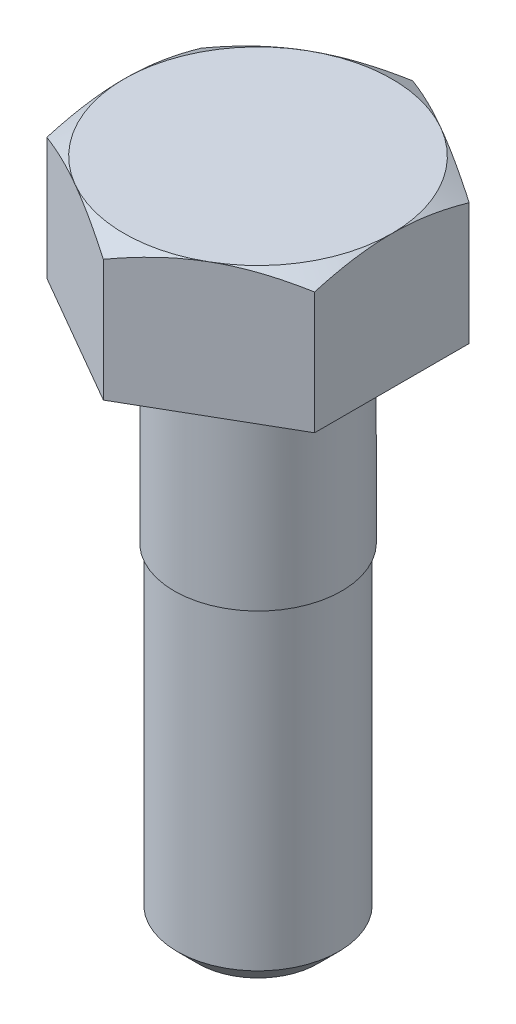
ISO-10303-21;
HEADER;
FILE_DESCRIPTION(('STEP AP214'),'2;1');
FILE_NAME('part.step','',(''),(''),'','','');
FILE_SCHEMA(('AUTOMOTIVE_DESIGN { 1 0 10303 214 1 1 1 1 }'));
ENDSEC;
DATA;
#1=APPLICATION_CONTEXT('core data for automotive mechanical design processes');
#2=APPLICATION_PROTOCOL_DEFINITION('international standard','automotive_design',2000,#1);
#3=PRODUCT_CONTEXT('',#1,'mechanical');
#4=PRODUCT('Part','Part','',(#3));
#5=PRODUCT_RELATED_PRODUCT_CATEGORY('part','',(#4));
#6=PRODUCT_DEFINITION_FORMATION('','',#4);
#7=PRODUCT_DEFINITION_CONTEXT('part definition',#1,'design');
#8=PRODUCT_DEFINITION('design','',#6,#7);
#9=PRODUCT_DEFINITION_SHAPE('','',#8);
#10=(LENGTH_UNIT() NAMED_UNIT(*) SI_UNIT(.MILLI.,.METRE.));
#11=(NAMED_UNIT(*) PLANE_ANGLE_UNIT() SI_UNIT($,.RADIAN.));
#12=(NAMED_UNIT(*) SI_UNIT($,.STERADIAN.) SOLID_ANGLE_UNIT());
#13=UNCERTAINTY_MEASURE_WITH_UNIT(LENGTH_MEASURE(1.E-05),#10,'distance_accuracy_value','');
#14=(GEOMETRIC_REPRESENTATION_CONTEXT(3) GLOBAL_UNCERTAINTY_ASSIGNED_CONTEXT((#13)) GLOBAL_UNIT_ASSIGNED_CONTEXT((#10,
#11,#12)) REPRESENTATION_CONTEXT('',''));
#15=CARTESIAN_POINT('',(0.,0.,0.));
#16=DIRECTION('',(0.,0.,1.));
#17=DIRECTION('',(1.,0.,0.));
#18=AXIS2_PLACEMENT_3D('',#15,#16,#17);
#19=CARTESIAN_POINT('',(0.,4.,4.61880215351701));
#20=DIRECTION('',(-0.5,0.,-0.866025403784438));
#21=DIRECTION('',(-0.866025403784438,0.,0.5));
#22=AXIS2_PLACEMENT_3D('',#19,#20,#21);
#23=PLANE('',#22);
#24=CARTESIAN_POINT('',(-0.000200000000000067,3.64266774092523,4.61891762357084));
#25=CARTESIAN_POINT('',(0.175579150323228,3.70128212635172,4.5174314838138));
#26=CARTESIAN_POINT('',(0.352875616326381,3.75458967853774,4.41506932144051));
#27=CARTESIAN_POINT('',(0.710538593175707,3.8476383292536,4.20857250547739));
#28=CARTESIAN_POINT('',(0.890911458970151,3.8873465109703,4.10443418285647));
#29=CARTESIAN_POINT('',(1.24942181870279,3.94915778471972,3.89744813015756));
#30=CARTESIAN_POINT('',(1.42750415293514,3.97167226847711,3.79463224655059));
#31=CARTESIAN_POINT('',(1.78450671716651,3.99854937685342,3.58851671999023));
#32=CARTESIAN_POINT('',(1.9634256496441,4.00293425857306,3.48521782616117));
#33=CARTESIAN_POINT('',(2.29774284219673,3.99380992706003,3.29219970504619));
#34=CARTESIAN_POINT('',(2.45319115998707,3.98254104601201,3.20245157692486));
#35=CARTESIAN_POINT('',(2.76307505563505,3.94682600920181,3.02354002635496));
#36=CARTESIAN_POINT('',(2.91750956174413,3.92236765428847,2.93437722268072));
#37=CARTESIAN_POINT('',(3.22803232777458,3.86122393508071,2.75509682012354));
#38=CARTESIAN_POINT('',(3.3840812880631,3.82427939634514,2.6650019108942));
#39=CARTESIAN_POINT('',(3.69385183540384,3.74042992745198,2.486155802));
#40=CARTESIAN_POINT('',(3.84757739077378,3.69354469778726,2.39740231122584));
#41=CARTESIAN_POINT('',(4.0002,3.64266774092524,2.30928560670466));
#42=B_SPLINE_CURVE_WITH_KNOTS('',3,(#24,#25,#26,#27,#28,#29,#30,#31,#32,#33,#34,#35,#36,#37,#38,
#39,#40,#41),.UNSPECIFIED.,.F.,.F.,(4,2,2,2,2,2,2,2,4),(0.,0.634047835695967,1.26961969224543,
1.88946157213122,2.50854226669297,3.04757825393386,3.58711366126903,4.13861653143764,
4.68903648037743),.UNSPECIFIED.);
#43=CARTESIAN_POINT('',(0.,3.64273441009184,4.61880215351701));
#44=VERTEX_POINT('',#43);
#45=CARTESIAN_POINT('',(2.,4.,3.46410161513775));
#46=VERTEX_POINT('',#45);
#47=EDGE_CURVE('E225',#44,#46,#42,.T.);
#48=ORIENTED_EDGE('',*,*,#47,.F.);
#49=DIRECTION('',(0.,-1.,0.));
#50=VECTOR('',#49,1.);
#51=CARTESIAN_POINT('',(0.,4.,4.61880215351701));
#52=LINE('',#51,#50);
#53=CARTESIAN_POINT('',(0.,0.,4.61880215351701));
#54=VERTEX_POINT('',#53);
#55=EDGE_CURVE('E228',#44,#54,#52,.T.);
#56=ORIENTED_EDGE('',*,*,#55,.T.);
#57=DIRECTION('',(0.866025403784438,0.,-0.5));
#58=VECTOR('',#57,1.);
#59=CARTESIAN_POINT('',(0.,0.,4.61880215351701));
#60=LINE('',#59,#58);
#61=CARTESIAN_POINT('',(4.,0.,2.3094010767585));
#62=VERTEX_POINT('',#61);
#63=EDGE_CURVE('E231',#54,#62,#60,.T.);
#64=ORIENTED_EDGE('',*,*,#63,.T.);
#65=DIRECTION('',(0.,-1.,0.));
#66=VECTOR('',#65,1.);
#67=CARTESIAN_POINT('',(4.,4.,2.3094010767585));
#68=LINE('',#67,#66);
#69=CARTESIAN_POINT('',(4.,3.64273441009184,2.3094010767585));
#70=VERTEX_POINT('',#69);
#71=EDGE_CURVE('E256',#70,#62,#68,.T.);
#72=ORIENTED_EDGE('',*,*,#71,.F.);
#73=EDGE_CURVE('E123',#46,#70,#42,.T.);
#74=ORIENTED_EDGE('',*,*,#73,.F.);
#75=EDGE_LOOP('',(#48,#56,#64,#72,#74));
#76=FACE_BOUND('',#75,.T.);
#77=ADVANCED_FACE('F46',(#76),#23,.F.);
#78=CARTESIAN_POINT('',(4.,4.,2.3094010767585));
#79=DIRECTION('',(-1.,0.,0.));
#80=DIRECTION('',(0.,0.,1.));
#81=AXIS2_PLACEMENT_3D('',#78,#79,#80);
#82=PLANE('',#81);
#83=CARTESIAN_POINT('',(4.,0.927598967629079,8.41970200336629));
#84=CARTESIAN_POINT('',(4.,1.02927249544285,8.22471125287416));
#85=CARTESIAN_POINT('',(4.,1.13045452595195,8.02946217046922));
#86=CARTESIAN_POINT('',(4.,1.33158592106674,7.63832086026492));
#87=CARTESIAN_POINT('',(4.,1.43153523756639,7.44242860774153));
#88=CARTESIAN_POINT('',(4.,1.63009197221316,7.04959604975217));
#89=CARTESIAN_POINT('',(4.,1.72869715953237,6.85265461490476));
#90=CARTESIAN_POINT('',(4.,1.92406175072036,6.45785981243659));
#91=CARTESIAN_POINT('',(4.,2.02082117513073,6.26000645499513));
#92=CARTESIAN_POINT('',(4.,2.21742229615827,5.85202602552045));
#93=CARTESIAN_POINT('',(4.,2.31713109265324,5.64183473748345));
#94=CARTESIAN_POINT('',(4.,2.51326392287801,5.21992650282253));
#95=CARTESIAN_POINT('',(4.,2.60968803143182,5.00820959108506));
#96=CARTESIAN_POINT('',(4.,2.79822013225856,4.58298305526725));
#97=CARTESIAN_POINT('',(4.,2.89033033394405,4.3694744163998));
#98=CARTESIAN_POINT('',(4.,3.06890994147927,3.94011602046117));
#99=CARTESIAN_POINT('',(4.,3.15537965077382,3.72426639005947));
#100=CARTESIAN_POINT('',(4.,3.33060636104784,3.26391629957711));
#101=CARTESIAN_POINT('',(4.,3.4184212232381,3.01905043746966));
#102=CARTESIAN_POINT('',(4.,3.54026899216701,2.64849307032331));
#103=CARTESIAN_POINT('',(4.,3.5792397524407,2.52442866823365));
#104=CARTESIAN_POINT('',(4.,3.65330249619426,2.27509081985544));
#105=CARTESIAN_POINT('',(4.,3.68839262415567,2.14981682606297));
#106=CARTESIAN_POINT('',(4.,3.78546863131465,1.77736679320915));
#107=CARTESIAN_POINT('',(4.,3.84100534867562,1.52841228826841));
#108=CARTESIAN_POINT('',(4.,3.90711433151542,1.1520560877433));
#109=CARTESIAN_POINT('',(4.,3.92628280498742,1.02613875727545));
#110=CARTESIAN_POINT('',(4.,3.95829165768471,0.773509956097666));
#111=CARTESIAN_POINT('',(4.,3.97113317306042,0.646798632109203));
#112=CARTESIAN_POINT('',(4.,3.99019226867548,0.39063698504198));
#113=CARTESIAN_POINT('',(4.,3.99628962920166,0.261177623419832));
#114=CARTESIAN_POINT('',(4.,4.00120917613831,0.00213570322873835));
#115=CARTESIAN_POINT('',(4.,4.00003228347664,-0.127446837668801));
#116=CARTESIAN_POINT('',(4.,3.99045098891296,-0.386369278315646));
#117=CARTESIAN_POINT('',(4.,3.98204514196177,-0.515709124369947));
#118=CARTESIAN_POINT('',(4.,3.95834234004528,-0.773744836818601));
#119=CARTESIAN_POINT('',(4.,3.94304508681519,-0.902440675096067));
#120=CARTESIAN_POINT('',(4.,3.88682271014479,-1.2926274438378));
#121=CARTESIAN_POINT('',(4.,3.83580504771448,-1.55270354569937));
#122=CARTESIAN_POINT('',(4.,3.74387291392249,-1.93898488738424));
#123=CARTESIAN_POINT('',(4.,3.71064792726023,-2.06714765628621));
#124=CARTESIAN_POINT('',(4.,3.63979278124232,-2.32225970074003));
#125=CARTESIAN_POINT('',(4.,3.60216261300993,-2.44920897384603));
#126=CARTESIAN_POINT('',(4.,3.48029161221864,-2.83916922113209));
#127=CARTESIAN_POINT('',(4.,3.38981122357504,-3.10022468695905));
#128=CARTESIAN_POINT('',(4.,3.19750760373212,-3.61813622323505));
#129=CARTESIAN_POINT('',(4.,3.09568035739669,-3.87499077006541));
#130=CARTESIAN_POINT('',(4.,2.88385901154187,-4.38572535695179));
#131=CARTESIAN_POINT('',(4.,2.77385321320004,-4.63960051037414));
#132=CARTESIAN_POINT('',(4.,2.54808209962563,-5.14471331761613));
#133=CARTESIAN_POINT('',(4.,2.43231763967899,-5.39595135643181));
#134=CARTESIAN_POINT('',(4.,2.20406176680537,-5.88045360858653));
#135=CARTESIAN_POINT('',(4.,2.09183271928775,-6.11384193506114));
#136=CARTESIAN_POINT('',(4.,1.8645187303802,-6.57923320809284));
#137=CARTESIAN_POINT('',(4.,1.74943366181641,-6.81123609238576));
#138=CARTESIAN_POINT('',(4.,1.51753450219448,-7.27316651527359));
#139=CARTESIAN_POINT('',(4.,1.400729588533,-7.5030986719804));
#140=CARTESIAN_POINT('',(4.,1.16537060450773,-7.96203793166202));
#141=CARTESIAN_POINT('',(4.,1.04681670858437,-8.19104512402765));
#142=CARTESIAN_POINT('',(4.,0.927598967629076,-8.41970200336629));
#143=B_SPLINE_CURVE_WITH_KNOTS('',3,(#83,#84,#85,#86,#87,#88,#89,#90,#91,#92,#93,#94,#95,#96,
#97,#98,#99,#100,#101,#102,#103,#104,#105,#106,#107,#108,#109,#110,#111,#112,#113,#114,#115,
#116,#117,#118,#119,#120,#121,#122,#123,#124,#125,#126,#127,#128,#129,#130,#131,#132,#133,#134,
#135,#136,#137,#138,#139,#140,#141,#142),.UNSPECIFIED.,.F.,.F.,(4,2,2,2,2,2,2,2,2,2,2,2,2,2,2,2,
2,2,2,2,2,2,2,2,2,2,2,2,2,4),(0.,0.659721716013327,1.31946909639789,1.98020332209099,
2.64093019014823,3.33883353242874,4.03672096607859,4.73424697063798,5.43173541898825,
6.21183614822333,6.60190006850226,6.99214969814155,7.75636327749357,8.13833728506492,
8.52024267542179,8.90885128448233,9.29741069630509,9.68604779820342,10.0747017221985,
10.8684879892147,11.2656399490468,11.6627927091809,12.4912392935349,13.3199799639229,
14.1499297818369,14.9797567001376,15.7566425720484,16.533563099686,17.3072536489236,
18.080867546435),.UNSPECIFIED.);
#144=CARTESIAN_POINT('',(4.,4.,0.));
#145=VERTEX_POINT('',#144);
#146=EDGE_CURVE('E119',#70,#145,#143,.T.);
#147=ORIENTED_EDGE('',*,*,#146,.F.);
#148=ORIENTED_EDGE('',*,*,#71,.T.);
#149=DIRECTION('',(0.,0.,-1.));
#150=VECTOR('',#149,1.);
#151=CARTESIAN_POINT('',(4.,0.,2.3094010767585));
#152=LINE('',#151,#150);
#153=CARTESIAN_POINT('',(4.,0.,-2.30940107675851));
#154=VERTEX_POINT('',#153);
#155=EDGE_CURVE('E268',#62,#154,#152,.T.);
#156=ORIENTED_EDGE('',*,*,#155,.T.);
#157=DIRECTION('',(0.,-1.,0.));
#158=VECTOR('',#157,1.);
#159=CARTESIAN_POINT('',(4.,4.,-2.30940107675851));
#160=LINE('',#159,#158);
#161=CARTESIAN_POINT('',(4.,3.64273441009184,-2.30940107675851));
#162=VERTEX_POINT('',#161);
#163=EDGE_CURVE('E145',#162,#154,#160,.T.);
#164=ORIENTED_EDGE('',*,*,#163,.F.);
#165=EDGE_CURVE('E128',#145,#162,#143,.T.);
#166=ORIENTED_EDGE('',*,*,#165,.F.);
#167=EDGE_LOOP('',(#147,#148,#156,#164,#166));
#168=FACE_BOUND('',#167,.T.);
#169=ADVANCED_FACE('F143',(#168),#82,.F.);
#170=CARTESIAN_POINT('',(4.,4.,-2.30940107675851));
#171=DIRECTION('',(-0.5,0.,0.866025403784439));
#172=DIRECTION('',(0.866025403784439,0.,0.5));
#173=AXIS2_PLACEMENT_3D('',#170,#171,#172);
#174=PLANE('',#173);
#175=CARTESIAN_POINT('',(4.0002,3.64266774092523,-2.30928560670467));
#176=CARTESIAN_POINT('',(3.82442084967677,3.70128212635172,-2.41077174646171));
#177=CARTESIAN_POINT('',(3.64712438367362,3.75458967853774,-2.513133908835));
#178=CARTESIAN_POINT('',(3.28946140682429,3.8476383292536,-2.71963072479812));
#179=CARTESIAN_POINT('',(3.10908854102985,3.8873465109703,-2.82376904741904));
#180=CARTESIAN_POINT('',(2.75057818129721,3.94915778471972,-3.03075510011795));
#181=CARTESIAN_POINT('',(2.57249584706486,3.97167226847711,-3.13357098372492));
#182=CARTESIAN_POINT('',(2.21549328283349,3.99854937685342,-3.33968651028528));
#183=CARTESIAN_POINT('',(2.0365743503559,4.00293425857306,-3.44298540411434));
#184=CARTESIAN_POINT('',(1.70225715780327,3.99380992706003,-3.63600352522932));
#185=CARTESIAN_POINT('',(1.54680884001293,3.98254104601201,-3.72575165335065));
#186=CARTESIAN_POINT('',(1.23692494436494,3.94682600920181,-3.90466320392054));
#187=CARTESIAN_POINT('',(1.08249043825587,3.92236765428847,-3.99382600759478));
#188=CARTESIAN_POINT('',(0.771967672225422,3.86122393508071,-4.17310641015197));
#189=CARTESIAN_POINT('',(0.615918711936898,3.82427939634514,-4.26320131938131));
#190=CARTESIAN_POINT('',(0.306148164596161,3.74042992745197,-4.4420474282755));
#191=CARTESIAN_POINT('',(0.152422609226221,3.69354469778726,-4.53080091904966));
#192=CARTESIAN_POINT('',(-0.000200000000000114,3.64266774092523,-4.61891762357085));
#193=B_SPLINE_CURVE_WITH_KNOTS('',3,(#175,#176,#177,#178,#179,#180,#181,#182,#183,#184,#185,
#186,#187,#188,#189,#190,#191,#192),.UNSPECIFIED.,.F.,.F.,(4,2,2,2,2,2,2,2,4),(0.,
0.634047835695966,1.26961969224543,1.88946157213122,2.50854226669297,3.04757825393386,
3.58711366126903,4.13861653143763,4.68903648037743),.UNSPECIFIED.);
#194=CARTESIAN_POINT('',(2.,4.,-3.46410161513775));
#195=VERTEX_POINT('',#194);
#196=EDGE_CURVE('E133',#162,#195,#193,.T.);
#197=ORIENTED_EDGE('',*,*,#196,.F.);
#198=ORIENTED_EDGE('',*,*,#163,.T.);
#199=DIRECTION('',(-0.866025403784439,0.,-0.5));
#200=VECTOR('',#199,1.);
#201=CARTESIAN_POINT('',(4.,0.,-2.30940107675851));
#202=LINE('',#201,#200);
#203=CARTESIAN_POINT('',(0.,0.,-4.61880215351701));
#204=VERTEX_POINT('',#203);
#205=EDGE_CURVE('E271',#154,#204,#202,.T.);
#206=ORIENTED_EDGE('',*,*,#205,.T.);
#207=DIRECTION('',(0.,-1.,0.));
#208=VECTOR('',#207,1.);
#209=CARTESIAN_POINT('',(0.,4.,-4.61880215351701));
#210=LINE('',#209,#208);
#211=CARTESIAN_POINT('',(0.,3.64273441009184,-4.61880215351701));
#212=VERTEX_POINT('',#211);
#213=EDGE_CURVE('E252',#212,#204,#210,.T.);
#214=ORIENTED_EDGE('',*,*,#213,.F.);
#215=EDGE_CURVE('E148',#195,#212,#193,.T.);
#216=ORIENTED_EDGE('',*,*,#215,.F.);
#217=EDGE_LOOP('',(#197,#198,#206,#214,#216));
#218=FACE_BOUND('',#217,.T.);
#219=ADVANCED_FACE('F211',(#218),#174,.F.);
#220=CARTESIAN_POINT('',(0.,4.,-4.61880215351701));
#221=DIRECTION('',(0.5,0.,0.866025403784438));
#222=DIRECTION('',(0.866025403784438,0.,-0.5));
#223=AXIS2_PLACEMENT_3D('',#220,#221,#222);
#224=PLANE('',#223);
#225=CARTESIAN_POINT('',(0.000200000000000038,3.64266774092523,-4.61891762357085));
#226=CARTESIAN_POINT('',(-0.175579150323228,3.70128212635172,-4.51743148381381));
#227=CARTESIAN_POINT('',(-0.352875616326381,3.75458967853774,-4.41506932144052));
#228=CARTESIAN_POINT('',(-0.710538593175706,3.8476383292536,-4.2085725054774));
#229=CARTESIAN_POINT('',(-0.890911458970151,3.8873465109703,-4.10443418285647));
#230=CARTESIAN_POINT('',(-1.24942181870279,3.94915778471972,-3.89744813015756));
#231=CARTESIAN_POINT('',(-1.42750415293514,3.97167226847711,-3.79463224655059));
#232=CARTESIAN_POINT('',(-1.78450671716651,3.99854937685342,-3.58851671999023));
#233=CARTESIAN_POINT('',(-1.9634256496441,4.00293425857306,-3.48521782616117));
#234=CARTESIAN_POINT('',(-2.29774284219673,3.99380992706003,-3.29219970504619));
#235=CARTESIAN_POINT('',(-2.45319115998707,3.98254104601201,-3.20245157692486));
#236=CARTESIAN_POINT('',(-2.76307505563506,3.94682600920181,-3.02354002635497));
#237=CARTESIAN_POINT('',(-2.91750956174413,3.92236765428847,-2.93437722268072));
#238=CARTESIAN_POINT('',(-3.22803232777458,3.86122393508071,-2.75509682012354));
#239=CARTESIAN_POINT('',(-3.3840812880631,3.82427939634514,-2.6650019108942));
#240=CARTESIAN_POINT('',(-3.69385183540384,3.74042992745197,-2.48615580200001));
#241=CARTESIAN_POINT('',(-3.84757739077378,3.69354469778726,-2.39740231122585));
#242=CARTESIAN_POINT('',(-4.0002,3.64266774092523,-2.30928560670466));
#243=B_SPLINE_CURVE_WITH_KNOTS('',3,(#225,#226,#227,#228,#229,#230,#231,#232,#233,#234,#235,
#236,#237,#238,#239,#240,#241,#242),.UNSPECIFIED.,.F.,.F.,(4,2,2,2,2,2,2,2,4),(0.,
0.634047835695967,1.26961969224543,1.88946157213122,2.50854226669297,3.04757825393386,
3.58711366126903,4.13861653143764,4.68903648037743),.UNSPECIFIED.);
#244=CARTESIAN_POINT('',(-2.,4.,-3.46410161513775));
#245=VERTEX_POINT('',#244);
#246=EDGE_CURVE('E205',#212,#245,#243,.T.);
#247=ORIENTED_EDGE('',*,*,#246,.F.);
#248=ORIENTED_EDGE('',*,*,#213,.T.);
#249=DIRECTION('',(-0.866025403784438,0.,0.5));
#250=VECTOR('',#249,1.);
#251=CARTESIAN_POINT('',(0.,0.,-4.61880215351701));
#252=LINE('',#251,#250);
#253=CARTESIAN_POINT('',(-4.,0.,-2.3094010767585));
#254=VERTEX_POINT('',#253);
#255=EDGE_CURVE('E275',#204,#254,#252,.T.);
#256=ORIENTED_EDGE('',*,*,#255,.T.);
#257=DIRECTION('',(0.,-1.,0.));
#258=VECTOR('',#257,1.);
#259=CARTESIAN_POINT('',(-4.,4.,-2.3094010767585));
#260=LINE('',#259,#258);
#261=CARTESIAN_POINT('',(-4.,3.64273441009184,-2.3094010767585));
#262=VERTEX_POINT('',#261);
#263=EDGE_CURVE('E244',#262,#254,#260,.T.);
#264=ORIENTED_EDGE('',*,*,#263,.F.);
#265=EDGE_CURVE('E198',#245,#262,#243,.T.);
#266=ORIENTED_EDGE('',*,*,#265,.F.);
#267=EDGE_LOOP('',(#247,#248,#256,#264,#266));
#268=FACE_BOUND('',#267,.T.);
#269=ADVANCED_FACE('F207',(#268),#224,.F.);
#270=CARTESIAN_POINT('',(-4.,4.,-2.3094010767585));
#271=DIRECTION('',(1.,0.,0.));
#272=DIRECTION('',(0.,0.,-1.));
#273=AXIS2_PLACEMENT_3D('',#270,#271,#272);
#274=PLANE('',#273);
#275=CARTESIAN_POINT('',(-4.,0.927598967629079,-8.41970200336629));
#276=CARTESIAN_POINT('',(-4.,1.02927249544285,-8.22471125287416));
#277=CARTESIAN_POINT('',(-4.,1.13045452595195,-8.02946217046922));
#278=CARTESIAN_POINT('',(-4.,1.33158592106674,-7.63832086026492));
#279=CARTESIAN_POINT('',(-4.,1.43153523756639,-7.44242860774153));
#280=CARTESIAN_POINT('',(-4.,1.63009197221316,-7.04959604975217));
#281=CARTESIAN_POINT('',(-4.,1.72869715953237,-6.85265461490476));
#282=CARTESIAN_POINT('',(-4.,1.92406175072036,-6.45785981243659));
#283=CARTESIAN_POINT('',(-4.,2.02082117513073,-6.26000645499513));
#284=CARTESIAN_POINT('',(-4.,2.21742229615827,-5.85202602552045));
#285=CARTESIAN_POINT('',(-4.,2.31713109265324,-5.64183473748345));
#286=CARTESIAN_POINT('',(-4.,2.51326392287801,-5.21992650282253));
#287=CARTESIAN_POINT('',(-4.,2.60968803143182,-5.00820959108506));
#288=CARTESIAN_POINT('',(-4.,2.79822013225856,-4.58298305526725));
#289=CARTESIAN_POINT('',(-4.,2.89033033394405,-4.3694744163998));
#290=CARTESIAN_POINT('',(-4.,3.06890994147927,-3.94011602046117));
#291=CARTESIAN_POINT('',(-4.,3.15537965077382,-3.72426639005947));
#292=CARTESIAN_POINT('',(-4.,3.33060636104784,-3.2639162995771));
#293=CARTESIAN_POINT('',(-4.,3.4184212232381,-3.01905043746966));
#294=CARTESIAN_POINT('',(-4.,3.54026899216701,-2.64849307032331));
#295=CARTESIAN_POINT('',(-4.,3.5792397524407,-2.52442866823365));
#296=CARTESIAN_POINT('',(-4.,3.65330249619425,-2.27509081985544));
#297=CARTESIAN_POINT('',(-4.,3.68839262415567,-2.14981682606297));
#298=CARTESIAN_POINT('',(-4.,3.78546863131465,-1.77736679320915));
#299=CARTESIAN_POINT('',(-4.,3.84100534867562,-1.52841228826841));
#300=CARTESIAN_POINT('',(-4.,3.90711433151542,-1.1520560877433));
#301=CARTESIAN_POINT('',(-4.,3.92628280498742,-1.02613875727544));
#302=CARTESIAN_POINT('',(-4.,3.95829165768471,-0.773509956097666));
#303=CARTESIAN_POINT('',(-4.,3.97113317306042,-0.646798632109202));
#304=CARTESIAN_POINT('',(-4.,3.99019226867547,-0.390636985041981));
#305=CARTESIAN_POINT('',(-4.,3.99628962920166,-0.261177623419833));
#306=CARTESIAN_POINT('',(-4.,4.00120917613831,-0.0021357032287403));
#307=CARTESIAN_POINT('',(-4.,4.00003228347664,0.127446837668799));
#308=CARTESIAN_POINT('',(-4.,3.99045098891296,0.386369278315644));
#309=CARTESIAN_POINT('',(-4.,3.98204514196177,0.515709124369945));
#310=CARTESIAN_POINT('',(-4.,3.95834234004528,0.773744836818599));
#311=CARTESIAN_POINT('',(-4.,3.94304508681519,0.902440675096065));
#312=CARTESIAN_POINT('',(-4.,3.88682271014478,1.2926274438378));
#313=CARTESIAN_POINT('',(-4.,3.83580504771448,1.55270354569937));
#314=CARTESIAN_POINT('',(-4.,3.74387291392249,1.93898488738424));
#315=CARTESIAN_POINT('',(-4.,3.71064792726023,2.06714765628621));
#316=CARTESIAN_POINT('',(-4.,3.63979278124232,2.32225970074003));
#317=CARTESIAN_POINT('',(-4.,3.60216261300993,2.44920897384603));
#318=CARTESIAN_POINT('',(-4.,3.48029161221864,2.83916922113209));
#319=CARTESIAN_POINT('',(-4.,3.38981122357504,3.10022468695905));
#320=CARTESIAN_POINT('',(-4.,3.19750760373211,3.61813622323505));
#321=CARTESIAN_POINT('',(-4.,3.09568035739669,3.87499077006541));
#322=CARTESIAN_POINT('',(-4.,2.88385901154187,4.38572535695179));
#323=CARTESIAN_POINT('',(-4.,2.77385321320004,4.63960051037414));
#324=CARTESIAN_POINT('',(-4.,2.54808209962563,5.14471331761613));
#325=CARTESIAN_POINT('',(-4.,2.43231763967899,5.39595135643181));
#326=CARTESIAN_POINT('',(-4.,2.20406176680537,5.88045360858653));
#327=CARTESIAN_POINT('',(-4.,2.09183271928775,6.11384193506114));
#328=CARTESIAN_POINT('',(-4.,1.8645187303802,6.57923320809284));
#329=CARTESIAN_POINT('',(-4.,1.7494336618164,6.81123609238576));
#330=CARTESIAN_POINT('',(-4.,1.51753450219448,7.27316651527359));
#331=CARTESIAN_POINT('',(-4.,1.400729588533,7.5030986719804));
#332=CARTESIAN_POINT('',(-4.,1.16537060450773,7.96203793166201));
#333=CARTESIAN_POINT('',(-4.,1.04681670858437,8.19104512402765));
#334=CARTESIAN_POINT('',(-4.,0.927598967629078,8.41970200336629));
#335=B_SPLINE_CURVE_WITH_KNOTS('',3,(#275,#276,#277,#278,#279,#280,#281,#282,#283,#284,#285,
#286,#287,#288,#289,#290,#291,#292,#293,#294,#295,#296,#297,#298,#299,#300,#301,#302,#303,#304,
#305,#306,#307,#308,#309,#310,#311,#312,#313,#314,#315,#316,#317,#318,#319,#320,#321,#322,#323,
#324,#325,#326,#327,#328,#329,#330,#331,#332,#333,#334),.UNSPECIFIED.,.F.,.F.,(4,2,2,2,2,2,2,2,
2,2,2,2,2,2,2,2,2,2,2,2,2,2,2,2,2,2,2,2,2,4),(0.,0.659721716013327,1.31946909639789,
1.98020332209099,2.64093019014823,3.33883353242873,4.03672096607859,4.73424697063798,
5.43173541898825,6.21183614822333,6.60190006850226,6.99214969814155,7.75636327749357,
8.13833728506492,8.52024267542179,8.90885128448233,9.29741069630508,9.68604779820342,
10.0747017221985,10.8684879892147,11.2656399490468,11.6627927091809,12.4912392935349,
13.3199799639229,14.1499297818369,14.9797567001376,15.7566425720484,16.533563099686,
17.3072536489236,18.080867546435),.UNSPECIFIED.);
#336=CARTESIAN_POINT('',(-4.,4.,0.));
#337=VERTEX_POINT('',#336);
#338=EDGE_CURVE('E206',#262,#337,#335,.T.);
#339=ORIENTED_EDGE('',*,*,#338,.F.);
#340=ORIENTED_EDGE('',*,*,#263,.T.);
#341=DIRECTION('',(0.,0.,1.));
#342=VECTOR('',#341,1.);
#343=CARTESIAN_POINT('',(-4.,0.,-2.3094010767585));
#344=LINE('',#343,#342);
#345=CARTESIAN_POINT('',(-4.,0.,2.3094010767585));
#346=VERTEX_POINT('',#345);
#347=EDGE_CURVE('E246',#254,#346,#344,.T.);
#348=ORIENTED_EDGE('',*,*,#347,.T.);
#349=DIRECTION('',(0.,-1.,0.));
#350=VECTOR('',#349,1.);
#351=CARTESIAN_POINT('',(-4.,4.,2.3094010767585));
#352=LINE('',#351,#350);
#353=CARTESIAN_POINT('',(-4.,3.64273441009184,2.3094010767585));
#354=VERTEX_POINT('',#353);
#355=EDGE_CURVE('E240',#354,#346,#352,.T.);
#356=ORIENTED_EDGE('',*,*,#355,.F.);
#357=EDGE_CURVE('E192',#337,#354,#335,.T.);
#358=ORIENTED_EDGE('',*,*,#357,.F.);
#359=EDGE_LOOP('',(#339,#340,#348,#356,#358));
#360=FACE_BOUND('',#359,.T.);
#361=ADVANCED_FACE('F210',(#360),#274,.F.);
#362=CARTESIAN_POINT('',(-4.,4.,2.3094010767585));
#363=DIRECTION('',(0.5,0.,-0.866025403784439));
#364=DIRECTION('',(-0.866025403784439,0.,-0.5));
#365=AXIS2_PLACEMENT_3D('',#362,#363,#364);
#366=PLANE('',#365);
#367=CARTESIAN_POINT('',(-4.0002,3.64266774092523,2.30928560670467));
#368=CARTESIAN_POINT('',(-3.82442084967677,3.70128212635172,2.4107717464617));
#369=CARTESIAN_POINT('',(-3.64712438367362,3.75458967853774,2.51313390883499));
#370=CARTESIAN_POINT('',(-3.28946140682429,3.8476383292536,2.71963072479811));
#371=CARTESIAN_POINT('',(-3.10908854102985,3.8873465109703,2.82376904741904));
#372=CARTESIAN_POINT('',(-2.75057818129721,3.94915778471972,3.03075510011795));
#373=CARTESIAN_POINT('',(-2.57249584706486,3.97167226847711,3.13357098372492));
#374=CARTESIAN_POINT('',(-2.21549328283349,3.99854937685342,3.33968651028528));
#375=CARTESIAN_POINT('',(-2.0365743503559,4.00293425857306,3.44298540411434));
#376=CARTESIAN_POINT('',(-1.70225715780327,3.99380992706003,3.63600352522932));
#377=CARTESIAN_POINT('',(-1.54680884001293,3.98254104601201,3.72575165335064));
#378=CARTESIAN_POINT('',(-1.23692494436494,3.94682600920181,3.90466320392054));
#379=CARTESIAN_POINT('',(-1.08249043825587,3.92236765428847,3.99382600759478));
#380=CARTESIAN_POINT('',(-0.771967672225422,3.86122393508071,4.17310641015197));
#381=CARTESIAN_POINT('',(-0.615918711936898,3.82427939634514,4.26320131938131));
#382=CARTESIAN_POINT('',(-0.306148164596161,3.74042992745198,4.4420474282755));
#383=CARTESIAN_POINT('',(-0.152422609226221,3.69354469778726,4.53080091904966));
#384=CARTESIAN_POINT('',(0.00019999999999933,3.64266774092524,4.61891762357084));
#385=B_SPLINE_CURVE_WITH_KNOTS('',3,(#367,#368,#369,#370,#371,#372,#373,#374,#375,#376,#377,
#378,#379,#380,#381,#382,#383,#384),.UNSPECIFIED.,.F.,.F.,(4,2,2,2,2,2,2,2,4),(0.,
0.634047835695966,1.26961969224543,1.88946157213122,2.50854226669297,3.04757825393386,
3.58711366126903,4.13861653143764,4.68903648037743),.UNSPECIFIED.);
#386=CARTESIAN_POINT('',(-2.,4.,3.46410161513775));
#387=VERTEX_POINT('',#386);
#388=EDGE_CURVE('E307',#354,#387,#385,.T.);
#389=ORIENTED_EDGE('',*,*,#388,.F.);
#390=ORIENTED_EDGE('',*,*,#355,.T.);
#391=DIRECTION('',(0.866025403784439,0.,0.5));
#392=VECTOR('',#391,1.);
#393=CARTESIAN_POINT('',(-4.,0.,2.3094010767585));
#394=LINE('',#393,#392);
#395=EDGE_CURVE('E237',#346,#54,#394,.T.);
#396=ORIENTED_EDGE('',*,*,#395,.T.);
#397=ORIENTED_EDGE('',*,*,#55,.F.);
#398=EDGE_CURVE('E139',#387,#44,#385,.T.);
#399=ORIENTED_EDGE('',*,*,#398,.F.);
#400=EDGE_LOOP('',(#389,#390,#396,#397,#399));
#401=FACE_BOUND('',#400,.T.);
#402=ADVANCED_FACE('F235',(#401),#366,.F.);
#403=CARTESIAN_POINT('',(0.,0.,0.));
#404=DIRECTION('',(0.,1.,0.));
#405=DIRECTION('',(0.,0.,1.));
#406=AXIS2_PLACEMENT_3D('',#403,#404,#405);
#407=PLANE('',#406);
#408=CARTESIAN_POINT('',(0.,0.,0.));
#409=DIRECTION('',(0.,-1.,0.));
#410=DIRECTION('',(0.,0.,-1.));
#411=AXIS2_PLACEMENT_3D('',#408,#409,#410);
#412=CIRCLE('',#411,2.5);
#413=CARTESIAN_POINT('',(0.,0.,-2.5));
#414=VERTEX_POINT('',#413);
#415=EDGE_CURVE('E258',#414,#414,#412,.T.);
#416=ORIENTED_EDGE('',*,*,#415,.F.);
#417=EDGE_LOOP('',(#416));
#418=FACE_BOUND('',#417,.T.);
#419=ORIENTED_EDGE('',*,*,#63,.F.);
#420=ORIENTED_EDGE('',*,*,#395,.F.);
#421=ORIENTED_EDGE('',*,*,#347,.F.);
#422=ORIENTED_EDGE('',*,*,#255,.F.);
#423=ORIENTED_EDGE('',*,*,#205,.F.);
#424=ORIENTED_EDGE('',*,*,#155,.F.);
#425=EDGE_LOOP('',(#419,#420,#421,#422,#423,#424));
#426=FACE_BOUND('',#425,.T.);
#427=ADVANCED_FACE('F288',(#418,#426),#407,.F.);
#428=CARTESIAN_POINT('',(0.,-16.,0.));
#429=DIRECTION('',(0.,1.,0.));
#430=DIRECTION('',(0.,0.,1.));
#431=AXIS2_PLACEMENT_3D('',#428,#429,#430);
#432=CYLINDRICAL_SURFACE('',#431,2.5);
#433=CARTESIAN_POINT('',(0.,-6.,0.));
#434=DIRECTION('',(0.,1.,0.));
#435=DIRECTION('',(0.,0.,1.));
#436=AXIS2_PLACEMENT_3D('',#433,#434,#435);
#437=CIRCLE('',#436,2.5);
#438=CARTESIAN_POINT('',(0.,-6.,2.5));
#439=VERTEX_POINT('',#438);
#440=EDGE_CURVE('E314',#439,#439,#437,.T.);
#441=ORIENTED_EDGE('',*,*,#440,.T.);
#442=EDGE_LOOP('',(#441));
#443=FACE_BOUND('',#442,.T.);
#444=ORIENTED_EDGE('',*,*,#415,.T.);
#445=EDGE_LOOP('',(#444));
#446=FACE_BOUND('',#445,.T.);
#447=ADVANCED_FACE('F174',(#443,#446),#432,.T.);
#448=CARTESIAN_POINT('',(0.,4.,0.));
#449=DIRECTION('',(0.,-1.,0.));
#450=DIRECTION('',(0.,0.,1.));
#451=AXIS2_PLACEMENT_3D('',#448,#449,#450);
#452=CONICAL_SURFACE('',#451,4.,1.0471975511966);
#453=ORIENTED_EDGE('',*,*,#47,.T.);
#454=CARTESIAN_POINT('',(0.,4.,0.));
#455=DIRECTION('',(0.,1.,0.));
#456=DIRECTION('',(0.,0.,1.));
#457=AXIS2_PLACEMENT_3D('',#454,#455,#456);
#458=CIRCLE('',#457,4.);
#459=EDGE_CURVE('E50',#387,#46,#458,.T.);
#460=ORIENTED_EDGE('',*,*,#459,.F.);
#461=ORIENTED_EDGE('',*,*,#398,.T.);
#462=EDGE_LOOP('',(#453,#460,#461));
#463=FACE_BOUND('',#462,.T.);
#464=ADVANCED_FACE('F168',(#463),#452,.T.);
#465=ORIENTED_EDGE('',*,*,#357,.T.);
#466=ORIENTED_EDGE('',*,*,#388,.T.);
#467=EDGE_CURVE('E71',#337,#387,#458,.T.);
#468=ORIENTED_EDGE('',*,*,#467,.F.);
#469=EDGE_LOOP('',(#465,#466,#468));
#470=FACE_BOUND('',#469,.T.);
#471=ADVANCED_FACE('F173',(#470),#452,.T.);
#472=ORIENTED_EDGE('',*,*,#265,.T.);
#473=ORIENTED_EDGE('',*,*,#338,.T.);
#474=EDGE_CURVE('E299',#245,#337,#458,.T.);
#475=ORIENTED_EDGE('',*,*,#474,.F.);
#476=EDGE_LOOP('',(#472,#473,#475));
#477=FACE_BOUND('',#476,.T.);
#478=ADVANCED_FACE('F300',(#477),#452,.T.);
#479=ORIENTED_EDGE('',*,*,#215,.T.);
#480=ORIENTED_EDGE('',*,*,#246,.T.);
#481=EDGE_CURVE('E56',#195,#245,#458,.T.);
#482=ORIENTED_EDGE('',*,*,#481,.F.);
#483=EDGE_LOOP('',(#479,#480,#482));
#484=FACE_BOUND('',#483,.T.);
#485=ADVANCED_FACE('F296',(#484),#452,.T.);
#486=ORIENTED_EDGE('',*,*,#165,.T.);
#487=ORIENTED_EDGE('',*,*,#196,.T.);
#488=EDGE_CURVE('E12',#145,#195,#458,.T.);
#489=ORIENTED_EDGE('',*,*,#488,.F.);
#490=EDGE_LOOP('',(#486,#487,#489));
#491=FACE_BOUND('',#490,.T.);
#492=ADVANCED_FACE('F131',(#491),#452,.T.);
#493=ORIENTED_EDGE('',*,*,#73,.T.);
#494=ORIENTED_EDGE('',*,*,#146,.T.);
#495=CARTESIAN_POINT('',(0.,4.,0.));
#496=DIRECTION('',(0.,1.,0.));
#497=DIRECTION('',(0.,0.,1.));
#498=AXIS2_PLACEMENT_3D('',#495,#496,#497);
#499=CIRCLE('',#498,4.);
#500=EDGE_CURVE('E63',#46,#145,#499,.T.);
#501=ORIENTED_EDGE('',*,*,#500,.F.);
#502=EDGE_LOOP('',(#493,#494,#501));
#503=FACE_BOUND('',#502,.T.);
#504=ADVANCED_FACE('F121',(#503),#452,.T.);
#505=CARTESIAN_POINT('',(0.,4.,0.));
#506=DIRECTION('',(0.,1.,0.));
#507=DIRECTION('',(0.,0.,1.));
#508=AXIS2_PLACEMENT_3D('',#505,#506,#507);
#509=PLANE('',#508);
#510=ORIENTED_EDGE('',*,*,#459,.T.);
#511=ORIENTED_EDGE('',*,*,#500,.T.);
#512=ORIENTED_EDGE('',*,*,#488,.T.);
#513=ORIENTED_EDGE('',*,*,#481,.T.);
#514=ORIENTED_EDGE('',*,*,#474,.T.);
#515=ORIENTED_EDGE('',*,*,#467,.T.);
#516=EDGE_LOOP('',(#510,#511,#512,#513,#514,#515));
#517=FACE_BOUND('',#516,.T.);
#518=ADVANCED_FACE('F137',(#517),#509,.T.);
#519=CARTESIAN_POINT('',(0.,-16.,0.));
#520=DIRECTION('',(0.,1.,0.));
#521=DIRECTION('',(0.,0.,1.));
#522=AXIS2_PLACEMENT_3D('',#519,#520,#521);
#523=CYLINDRICAL_SURFACE('',#522,2.413);
#524=CARTESIAN_POINT('',(0.,-6.,0.));
#525=DIRECTION('',(0.,1.,0.));
#526=DIRECTION('',(0.,0.,1.));
#527=AXIS2_PLACEMENT_3D('',#524,#525,#526);
#528=CIRCLE('',#527,2.413);
#529=CARTESIAN_POINT('',(0.,-6.,2.413));
#530=VERTEX_POINT('',#529);
#531=EDGE_CURVE('E140',#530,#530,#528,.T.);
#532=ORIENTED_EDGE('',*,*,#531,.F.);
#533=EDGE_LOOP('',(#532));
#534=FACE_BOUND('',#533,.T.);
#535=CARTESIAN_POINT('',(0.,-15.37008,0.));
#536=DIRECTION('',(0.,1.,0.));
#537=DIRECTION('',(0.,0.,1.));
#538=AXIS2_PLACEMENT_3D('',#535,#536,#537);
#539=CIRCLE('',#538,2.413);
#540=CARTESIAN_POINT('',(0.,-15.37008,2.413));
#541=VERTEX_POINT('',#540);
#542=EDGE_CURVE('E322',#541,#541,#539,.T.);
#543=ORIENTED_EDGE('',*,*,#542,.T.);
#544=EDGE_LOOP('',(#543));
#545=FACE_BOUND('',#544,.T.);
#546=ADVANCED_FACE('F176',(#534,#545),#523,.T.);
#547=CARTESIAN_POINT('',(2.413,-6.,0.));
#548=DIRECTION('',(0.,1.,0.));
#549=DIRECTION('',(0.,0.,1.));
#550=AXIS2_PLACEMENT_3D('',#547,#548,#549);
#551=PLANE('',#550);
#552=ORIENTED_EDGE('',*,*,#440,.F.);
#553=EDGE_LOOP('',(#552));
#554=FACE_BOUND('',#553,.T.);
#555=ORIENTED_EDGE('',*,*,#531,.T.);
#556=EDGE_LOOP('',(#555));
#557=FACE_BOUND('',#556,.T.);
#558=ADVANCED_FACE('F332',(#554,#557),#551,.F.);
#559=CARTESIAN_POINT('',(0.,-16.,0.));
#560=DIRECTION('',(0.,1.,0.));
#561=DIRECTION('',(0.,0.,1.));
#562=AXIS2_PLACEMENT_3D('',#559,#560,#561);
#563=CONICAL_SURFACE('',#562,1.78308,0.785398163397456);
#564=ORIENTED_EDGE('',*,*,#542,.F.);
#565=EDGE_LOOP('',(#564));
#566=FACE_BOUND('',#565,.T.);
#567=CARTESIAN_POINT('',(0.,-16.,0.));
#568=DIRECTION('',(0.,1.,0.));
#569=DIRECTION('',(0.,0.,1.));
#570=AXIS2_PLACEMENT_3D('',#567,#568,#569);
#571=CIRCLE('',#570,1.78308);
#572=CARTESIAN_POINT('',(0.,-16.,1.78308));
#573=VERTEX_POINT('',#572);
#574=EDGE_CURVE('E318',#573,#573,#571,.T.);
#575=ORIENTED_EDGE('',*,*,#574,.T.);
#576=EDGE_LOOP('',(#575));
#577=FACE_BOUND('',#576,.T.);
#578=ADVANCED_FACE('F329',(#566,#577),#563,.T.);
#579=CARTESIAN_POINT('',(0.,-16.,0.));
#580=DIRECTION('',(0.,-1.,0.));
#581=DIRECTION('',(0.,0.,-1.));
#582=AXIS2_PLACEMENT_3D('',#579,#580,#581);
#583=PLANE('',#582);
#584=ORIENTED_EDGE('',*,*,#574,.F.);
#585=EDGE_LOOP('',(#584));
#586=FACE_BOUND('',#585,.T.);
#587=ADVANCED_FACE('F178',(#586),#583,.T.);
#588=CLOSED_SHELL('',(#77,#169,#219,#269,#361,#402,#427,#447,#464,#471,#478,#485,#492,#504,#518,
#546,#558,#578,#587));
#589=MANIFOLD_SOLID_BREP('B2',#588);
#590=ADVANCED_BREP_SHAPE_REPRESENTATION('',(#18,#589),#14);
#591=SHAPE_DEFINITION_REPRESENTATION(#9,#590);
ENDSEC;
END-ISO-10303-21;
